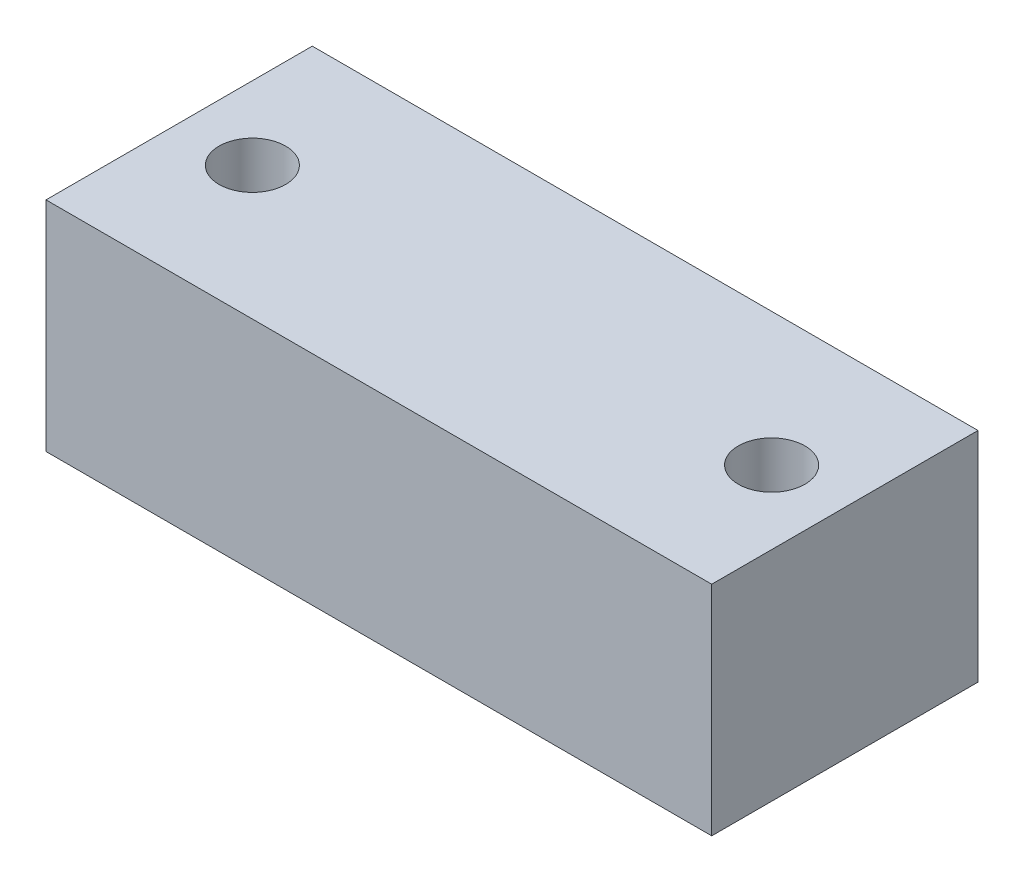
ISO-10303-21;
HEADER;
FILE_DESCRIPTION(('STEP AP214'),'2;1');
FILE_NAME('part.step','',(''),(''),'','','');
FILE_SCHEMA(('AUTOMOTIVE_DESIGN { 1 0 10303 214 1 1 1 1 }'));
ENDSEC;
DATA;
#1=APPLICATION_CONTEXT('core data for automotive mechanical design processes');
#2=APPLICATION_PROTOCOL_DEFINITION('international standard','automotive_design',2000,#1);
#3=PRODUCT_CONTEXT('',#1,'mechanical');
#4=PRODUCT('Part','Part','',(#3));
#5=PRODUCT_RELATED_PRODUCT_CATEGORY('part','',(#4));
#6=PRODUCT_DEFINITION_FORMATION('','',#4);
#7=PRODUCT_DEFINITION_CONTEXT('part definition',#1,'design');
#8=PRODUCT_DEFINITION('design','',#6,#7);
#9=PRODUCT_DEFINITION_SHAPE('','',#8);
#10=(LENGTH_UNIT() NAMED_UNIT(*) SI_UNIT(.MILLI.,.METRE.));
#11=(NAMED_UNIT(*) PLANE_ANGLE_UNIT() SI_UNIT($,.RADIAN.));
#12=(NAMED_UNIT(*) SI_UNIT($,.STERADIAN.) SOLID_ANGLE_UNIT());
#13=UNCERTAINTY_MEASURE_WITH_UNIT(LENGTH_MEASURE(1.E-05),#10,'distance_accuracy_value','');
#14=(GEOMETRIC_REPRESENTATION_CONTEXT(3) GLOBAL_UNCERTAINTY_ASSIGNED_CONTEXT((#13)) GLOBAL_UNIT_ASSIGNED_CONTEXT((#10,
#11,#12)) REPRESENTATION_CONTEXT('',''));
#15=CARTESIAN_POINT('',(0.,0.,0.));
#16=DIRECTION('',(0.,0.,1.));
#17=DIRECTION('',(1.,0.,0.));
#18=AXIS2_PLACEMENT_3D('',#15,#16,#17);
#19=CARTESIAN_POINT('',(-25.,16.37,-10.));
#20=DIRECTION('',(1.,0.,0.));
#21=DIRECTION('',(0.,0.,-1.));
#22=AXIS2_PLACEMENT_3D('',#19,#20,#21);
#23=PLANE('',#22);
#24=DIRECTION('',(0.,0.,1.));
#25=VECTOR('',#24,1.);
#26=CARTESIAN_POINT('',(-25.,0.,-10.));
#27=LINE('',#26,#25);
#28=CARTESIAN_POINT('',(-25.,0.,-10.));
#29=VERTEX_POINT('',#28);
#30=CARTESIAN_POINT('',(-25.,0.,10.));
#31=VERTEX_POINT('',#30);
#32=EDGE_CURVE('E97',#29,#31,#27,.T.);
#33=ORIENTED_EDGE('',*,*,#32,.T.);
#34=DIRECTION('',(0.,-1.,0.));
#35=VECTOR('',#34,1.);
#36=CARTESIAN_POINT('',(-25.,16.37,10.));
#37=LINE('',#36,#35);
#38=CARTESIAN_POINT('',(-25.,16.37,10.));
#39=VERTEX_POINT('',#38);
#40=EDGE_CURVE('E11',#39,#31,#37,.T.);
#41=ORIENTED_EDGE('',*,*,#40,.F.);
#42=DIRECTION('',(0.,0.,1.));
#43=VECTOR('',#42,1.);
#44=CARTESIAN_POINT('',(-25.,16.37,-10.));
#45=LINE('',#44,#43);
#46=CARTESIAN_POINT('',(-25.,16.37,-10.));
#47=VERTEX_POINT('',#46);
#48=EDGE_CURVE('E85',#47,#39,#45,.T.);
#49=ORIENTED_EDGE('',*,*,#48,.F.);
#50=DIRECTION('',(0.,-1.,0.));
#51=VECTOR('',#50,1.);
#52=CARTESIAN_POINT('',(-25.,16.37,-10.));
#53=LINE('',#52,#51);
#54=EDGE_CURVE('E93',#47,#29,#53,.T.);
#55=ORIENTED_EDGE('',*,*,#54,.T.);
#56=EDGE_LOOP('',(#33,#41,#49,#55));
#57=FACE_BOUND('',#56,.T.);
#58=ADVANCED_FACE('F34',(#57),#23,.F.);
#59=CARTESIAN_POINT('',(-25.,16.37,10.));
#60=DIRECTION('',(0.,0.,-1.));
#61=DIRECTION('',(-1.,0.,0.));
#62=AXIS2_PLACEMENT_3D('',#59,#60,#61);
#63=PLANE('',#62);
#64=DIRECTION('',(1.,0.,0.));
#65=VECTOR('',#64,1.);
#66=CARTESIAN_POINT('',(-25.,0.,10.));
#67=LINE('',#66,#65);
#68=CARTESIAN_POINT('',(25.,0.,9.99999999999999));
#69=VERTEX_POINT('',#68);
#70=EDGE_CURVE('E89',#31,#69,#67,.T.);
#71=ORIENTED_EDGE('',*,*,#70,.T.);
#72=DIRECTION('',(0.,-1.,0.));
#73=VECTOR('',#72,1.);
#74=CARTESIAN_POINT('',(25.,16.37,9.99999999999999));
#75=LINE('',#74,#73);
#76=CARTESIAN_POINT('',(25.,16.37,9.99999999999999));
#77=VERTEX_POINT('',#76);
#78=EDGE_CURVE('E42',#77,#69,#75,.T.);
#79=ORIENTED_EDGE('',*,*,#78,.F.);
#80=DIRECTION('',(1.,0.,0.));
#81=VECTOR('',#80,1.);
#82=CARTESIAN_POINT('',(-25.,16.37,10.));
#83=LINE('',#82,#81);
#84=EDGE_CURVE('E80',#39,#77,#83,.T.);
#85=ORIENTED_EDGE('',*,*,#84,.F.);
#86=ORIENTED_EDGE('',*,*,#40,.T.);
#87=EDGE_LOOP('',(#71,#79,#85,#86));
#88=FACE_BOUND('',#87,.T.);
#89=ADVANCED_FACE('F88',(#88),#63,.F.);
#90=CARTESIAN_POINT('',(25.,16.37,-10.));
#91=DIRECTION('',(-1.,0.,0.));
#92=DIRECTION('',(0.,0.,1.));
#93=AXIS2_PLACEMENT_3D('',#90,#91,#92);
#94=PLANE('',#93);
#95=DIRECTION('',(0.,0.,-1.));
#96=VECTOR('',#95,1.);
#97=CARTESIAN_POINT('',(25.,0.,-10.));
#98=LINE('',#97,#96);
#99=CARTESIAN_POINT('',(25.,0.,-10.));
#100=VERTEX_POINT('',#99);
#101=EDGE_CURVE('E67',#69,#100,#98,.T.);
#102=ORIENTED_EDGE('',*,*,#101,.T.);
#103=DIRECTION('',(0.,-1.,0.));
#104=VECTOR('',#103,1.);
#105=CARTESIAN_POINT('',(25.,16.37,-10.));
#106=LINE('',#105,#104);
#107=CARTESIAN_POINT('',(25.,16.37,-10.));
#108=VERTEX_POINT('',#107);
#109=EDGE_CURVE('E90',#108,#100,#106,.T.);
#110=ORIENTED_EDGE('',*,*,#109,.F.);
#111=DIRECTION('',(0.,0.,-1.));
#112=VECTOR('',#111,1.);
#113=CARTESIAN_POINT('',(25.,16.37,-10.));
#114=LINE('',#113,#112);
#115=EDGE_CURVE('E83',#77,#108,#114,.T.);
#116=ORIENTED_EDGE('',*,*,#115,.F.);
#117=ORIENTED_EDGE('',*,*,#78,.T.);
#118=EDGE_LOOP('',(#102,#110,#116,#117));
#119=FACE_BOUND('',#118,.T.);
#120=ADVANCED_FACE('F91',(#119),#94,.F.);
#121=CARTESIAN_POINT('',(-25.,16.37,-10.));
#122=DIRECTION('',(0.,0.,1.));
#123=DIRECTION('',(1.,0.,0.));
#124=AXIS2_PLACEMENT_3D('',#121,#122,#123);
#125=PLANE('',#124);
#126=DIRECTION('',(-1.,0.,0.));
#127=VECTOR('',#126,1.);
#128=CARTESIAN_POINT('',(-25.,0.,-10.));
#129=LINE('',#128,#127);
#130=EDGE_CURVE('E73',#100,#29,#129,.T.);
#131=ORIENTED_EDGE('',*,*,#130,.T.);
#132=ORIENTED_EDGE('',*,*,#54,.F.);
#133=DIRECTION('',(-1.,0.,0.));
#134=VECTOR('',#133,1.);
#135=CARTESIAN_POINT('',(-25.,16.37,-10.));
#136=LINE('',#135,#134);
#137=EDGE_CURVE('E50',#108,#47,#136,.T.);
#138=ORIENTED_EDGE('',*,*,#137,.F.);
#139=ORIENTED_EDGE('',*,*,#109,.T.);
#140=EDGE_LOOP('',(#131,#132,#138,#139));
#141=FACE_BOUND('',#140,.T.);
#142=ADVANCED_FACE('F105',(#141),#125,.F.);
#143=CARTESIAN_POINT('',(0.,16.37,0.));
#144=DIRECTION('',(0.,1.,0.));
#145=DIRECTION('',(0.,0.,1.));
#146=AXIS2_PLACEMENT_3D('',#143,#144,#145);
#147=PLANE('',#146);
#148=CARTESIAN_POINT('',(-19.5,16.37,0.));
#149=DIRECTION('',(0.,1.,0.));
#150=DIRECTION('',(0.,0.,1.));
#151=AXIS2_PLACEMENT_3D('',#148,#149,#150);
#152=CIRCLE('',#151,2.5);
#153=CARTESIAN_POINT('',(-19.5,16.37,2.49999999999999));
#154=VERTEX_POINT('',#153);
#155=EDGE_CURVE('E117',#154,#154,#152,.T.);
#156=ORIENTED_EDGE('',*,*,#155,.F.);
#157=EDGE_LOOP('',(#156));
#158=FACE_BOUND('',#157,.T.);
#159=CARTESIAN_POINT('',(19.5,16.37,0.));
#160=DIRECTION('',(0.,1.,0.));
#161=DIRECTION('',(0.,0.,1.));
#162=AXIS2_PLACEMENT_3D('',#159,#160,#161);
#163=CIRCLE('',#162,2.5);
#164=CARTESIAN_POINT('',(19.5,16.37,2.49999999999998));
#165=VERTEX_POINT('',#164);
#166=EDGE_CURVE('E111',#165,#165,#163,.T.);
#167=ORIENTED_EDGE('',*,*,#166,.F.);
#168=EDGE_LOOP('',(#167));
#169=FACE_BOUND('',#168,.T.);
#170=ORIENTED_EDGE('',*,*,#48,.T.);
#171=ORIENTED_EDGE('',*,*,#84,.T.);
#172=ORIENTED_EDGE('',*,*,#115,.T.);
#173=ORIENTED_EDGE('',*,*,#137,.T.);
#174=EDGE_LOOP('',(#170,#171,#172,#173));
#175=FACE_BOUND('',#174,.T.);
#176=ADVANCED_FACE('F81',(#158,#169,#175),#147,.T.);
#177=CARTESIAN_POINT('',(0.,0.,0.));
#178=DIRECTION('',(0.,1.,0.));
#179=DIRECTION('',(0.,0.,1.));
#180=AXIS2_PLACEMENT_3D('',#177,#178,#179);
#181=PLANE('',#180);
#182=CARTESIAN_POINT('',(-19.5,0.,0.));
#183=DIRECTION('',(0.,1.,0.));
#184=DIRECTION('',(0.,0.,1.));
#185=AXIS2_PLACEMENT_3D('',#182,#183,#184);
#186=CIRCLE('',#185,2.5);
#187=CARTESIAN_POINT('',(-19.5,0.,2.49999999999999));
#188=VERTEX_POINT('',#187);
#189=EDGE_CURVE('E114',#188,#188,#186,.T.);
#190=ORIENTED_EDGE('',*,*,#189,.T.);
#191=EDGE_LOOP('',(#190));
#192=FACE_BOUND('',#191,.T.);
#193=CARTESIAN_POINT('',(19.5,0.,0.));
#194=DIRECTION('',(0.,1.,0.));
#195=DIRECTION('',(0.,0.,1.));
#196=AXIS2_PLACEMENT_3D('',#193,#194,#195);
#197=CIRCLE('',#196,2.5);
#198=CARTESIAN_POINT('',(19.5,0.,2.49999999999998));
#199=VERTEX_POINT('',#198);
#200=EDGE_CURVE('E100',#199,#199,#197,.T.);
#201=ORIENTED_EDGE('',*,*,#200,.T.);
#202=EDGE_LOOP('',(#201));
#203=FACE_BOUND('',#202,.T.);
#204=ORIENTED_EDGE('',*,*,#32,.F.);
#205=ORIENTED_EDGE('',*,*,#130,.F.);
#206=ORIENTED_EDGE('',*,*,#101,.F.);
#207=ORIENTED_EDGE('',*,*,#70,.F.);
#208=EDGE_LOOP('',(#204,#205,#206,#207));
#209=FACE_BOUND('',#208,.T.);
#210=ADVANCED_FACE('F108',(#192,#203,#209),#181,.F.);
#211=CARTESIAN_POINT('',(19.5,0.,0.));
#212=DIRECTION('',(0.,1.,0.));
#213=DIRECTION('',(0.,0.,1.));
#214=AXIS2_PLACEMENT_3D('',#211,#212,#213);
#215=CYLINDRICAL_SURFACE('',#214,2.5);
#216=ORIENTED_EDGE('',*,*,#200,.F.);
#217=EDGE_LOOP('',(#216));
#218=FACE_BOUND('',#217,.T.);
#219=ORIENTED_EDGE('',*,*,#166,.T.);
#220=EDGE_LOOP('',(#219));
#221=FACE_BOUND('',#220,.T.);
#222=ADVANCED_FACE('F128',(#218,#221),#215,.F.);
#223=CARTESIAN_POINT('',(-19.5,0.,0.));
#224=DIRECTION('',(0.,1.,0.));
#225=DIRECTION('',(0.,0.,1.));
#226=AXIS2_PLACEMENT_3D('',#223,#224,#225);
#227=CYLINDRICAL_SURFACE('',#226,2.5);
#228=ORIENTED_EDGE('',*,*,#189,.F.);
#229=EDGE_LOOP('',(#228));
#230=FACE_BOUND('',#229,.T.);
#231=ORIENTED_EDGE('',*,*,#155,.T.);
#232=EDGE_LOOP('',(#231));
#233=FACE_BOUND('',#232,.T.);
#234=ADVANCED_FACE('F125',(#230,#233),#227,.F.);
#235=CLOSED_SHELL('',(#58,#89,#120,#142,#176,#210,#222,#234));
#236=MANIFOLD_SOLID_BREP('B2',#235);
#237=ADVANCED_BREP_SHAPE_REPRESENTATION('',(#18,#236),#14);
#238=SHAPE_DEFINITION_REPRESENTATION(#9,#237);
ENDSEC;
END-ISO-10303-21;
